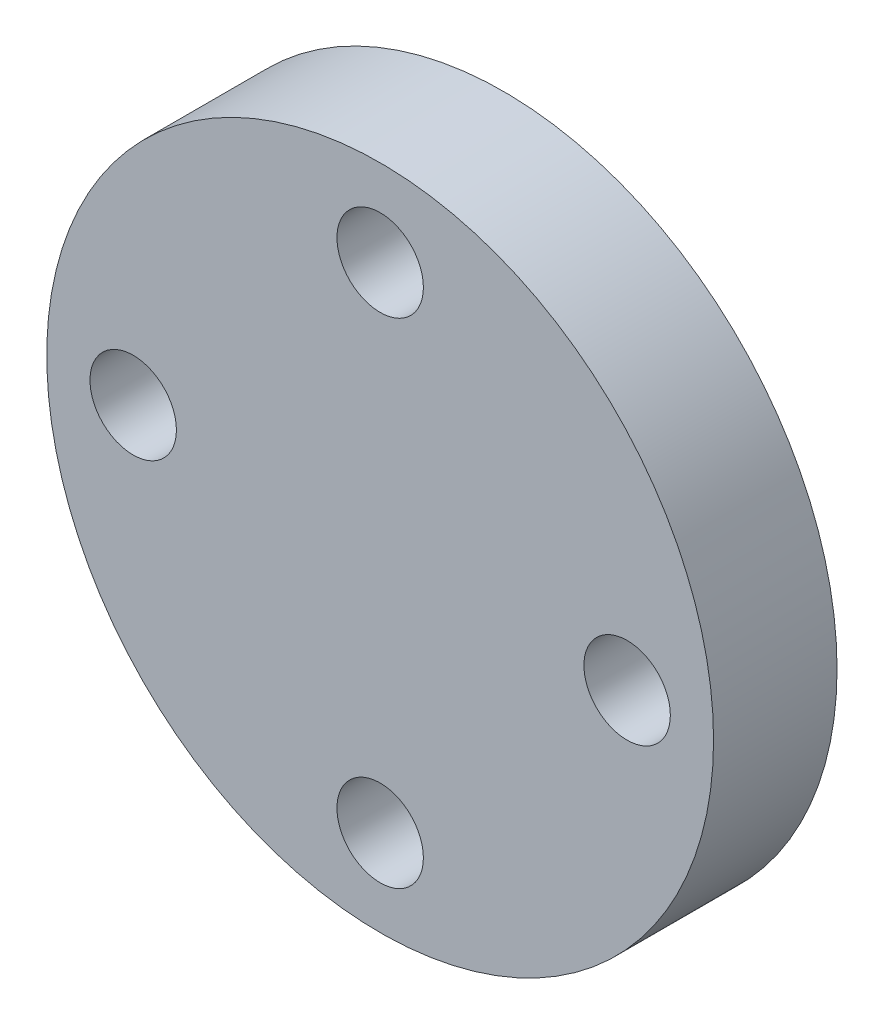
ISO-10303-21;
HEADER;
FILE_DESCRIPTION(('STEP AP214'),'2;1');
FILE_NAME('part.step','',(''),(''),'','','');
FILE_SCHEMA(('AUTOMOTIVE_DESIGN { 1 0 10303 214 1 1 1 1 }'));
ENDSEC;
DATA;
#1=APPLICATION_CONTEXT('core data for automotive mechanical design processes');
#2=APPLICATION_PROTOCOL_DEFINITION('international standard','automotive_design',2000,#1);
#3=PRODUCT_CONTEXT('',#1,'mechanical');
#4=PRODUCT('Part','Part','',(#3));
#5=PRODUCT_RELATED_PRODUCT_CATEGORY('part','',(#4));
#6=PRODUCT_DEFINITION_FORMATION('','',#4);
#7=PRODUCT_DEFINITION_CONTEXT('part definition',#1,'design');
#8=PRODUCT_DEFINITION('design','',#6,#7);
#9=PRODUCT_DEFINITION_SHAPE('','',#8);
#10=(LENGTH_UNIT() NAMED_UNIT(*) SI_UNIT(.MILLI.,.METRE.));
#11=(NAMED_UNIT(*) PLANE_ANGLE_UNIT() SI_UNIT($,.RADIAN.));
#12=(NAMED_UNIT(*) SI_UNIT($,.STERADIAN.) SOLID_ANGLE_UNIT());
#13=UNCERTAINTY_MEASURE_WITH_UNIT(LENGTH_MEASURE(1.E-05),#10,'distance_accuracy_value','');
#14=(GEOMETRIC_REPRESENTATION_CONTEXT(3) GLOBAL_UNCERTAINTY_ASSIGNED_CONTEXT((#13)) GLOBAL_UNIT_ASSIGNED_CONTEXT((#10,
#11,#12)) REPRESENTATION_CONTEXT('',''));
#15=CARTESIAN_POINT('',(0.,0.,0.));
#16=DIRECTION('',(0.,0.,1.));
#17=DIRECTION('',(1.,0.,0.));
#18=AXIS2_PLACEMENT_3D('',#15,#16,#17);
#19=CARTESIAN_POINT('',(0.,0.,5.));
#20=DIRECTION('',(0.,0.,1.));
#21=DIRECTION('',(1.,0.,0.));
#22=AXIS2_PLACEMENT_3D('',#19,#20,#21);
#23=PLANE('',#22);
#24=CARTESIAN_POINT('',(10.,0.,5.));
#25=DIRECTION('',(0.,0.,1.));
#26=DIRECTION('',(1.,0.,0.));
#27=AXIS2_PLACEMENT_3D('',#24,#25,#26);
#28=CIRCLE('',#27,1.75);
#29=CARTESIAN_POINT('',(11.75,0.,5.));
#30=VERTEX_POINT('',#29);
#31=EDGE_CURVE('E57',#30,#30,#28,.T.);
#32=ORIENTED_EDGE('',*,*,#31,.F.);
#33=EDGE_LOOP('',(#32));
#34=FACE_BOUND('',#33,.T.);
#35=CARTESIAN_POINT('',(-10.,0.,5.));
#36=DIRECTION('',(0.,0.,1.));
#37=DIRECTION('',(1.,0.,0.));
#38=AXIS2_PLACEMENT_3D('',#35,#36,#37);
#39=CIRCLE('',#38,1.75);
#40=CARTESIAN_POINT('',(-8.25,0.,5.));
#41=VERTEX_POINT('',#40);
#42=EDGE_CURVE('E46',#41,#41,#39,.T.);
#43=ORIENTED_EDGE('',*,*,#42,.F.);
#44=EDGE_LOOP('',(#43));
#45=FACE_BOUND('',#44,.T.);
#46=CARTESIAN_POINT('',(0.,0.,5.));
#47=DIRECTION('',(0.,0.,1.));
#48=DIRECTION('',(1.,0.,0.));
#49=AXIS2_PLACEMENT_3D('',#46,#47,#48);
#50=CIRCLE('',#49,13.5);
#51=CARTESIAN_POINT('',(13.5,0.,5.));
#52=VERTEX_POINT('',#51);
#53=EDGE_CURVE('E10',#52,#52,#50,.T.);
#54=ORIENTED_EDGE('',*,*,#53,.T.);
#55=EDGE_LOOP('',(#54));
#56=FACE_BOUND('',#55,.T.);
#57=CARTESIAN_POINT('',(0.,10.,5.));
#58=DIRECTION('',(0.,0.,1.));
#59=DIRECTION('',(1.,0.,0.));
#60=AXIS2_PLACEMENT_3D('',#57,#58,#59);
#61=CIRCLE('',#60,1.75);
#62=CARTESIAN_POINT('',(1.75000000000003,10.,5.));
#63=VERTEX_POINT('',#62);
#64=EDGE_CURVE('E51',#63,#63,#61,.T.);
#65=ORIENTED_EDGE('',*,*,#64,.F.);
#66=EDGE_LOOP('',(#65));
#67=FACE_BOUND('',#66,.T.);
#68=CARTESIAN_POINT('',(-1.04744440165294E-13,-10.,5.));
#69=DIRECTION('',(0.,0.,1.));
#70=DIRECTION('',(1.,0.,0.));
#71=AXIS2_PLACEMENT_3D('',#68,#69,#70);
#72=CIRCLE('',#71,1.75);
#73=CARTESIAN_POINT('',(1.7499999999999,-10.,5.));
#74=VERTEX_POINT('',#73);
#75=EDGE_CURVE('E63',#74,#74,#72,.T.);
#76=ORIENTED_EDGE('',*,*,#75,.F.);
#77=EDGE_LOOP('',(#76));
#78=FACE_BOUND('',#77,.T.);
#79=ADVANCED_FACE('F35',(#34,#45,#56,#67,#78),#23,.T.);
#80=CARTESIAN_POINT('',(0.,0.,0.));
#81=DIRECTION('',(0.,0.,1.));
#82=DIRECTION('',(1.,0.,0.));
#83=AXIS2_PLACEMENT_3D('',#80,#81,#82);
#84=PLANE('',#83);
#85=CARTESIAN_POINT('',(0.,0.,0.));
#86=DIRECTION('',(0.,0.,1.));
#87=DIRECTION('',(1.,0.,0.));
#88=AXIS2_PLACEMENT_3D('',#85,#86,#87);
#89=CIRCLE('',#88,13.5);
#90=CARTESIAN_POINT('',(13.5,0.,0.));
#91=VERTEX_POINT('',#90);
#92=EDGE_CURVE('E39',#91,#91,#89,.T.);
#93=ORIENTED_EDGE('',*,*,#92,.F.);
#94=EDGE_LOOP('',(#93));
#95=FACE_BOUND('',#94,.T.);
#96=CARTESIAN_POINT('',(-10.,0.,0.));
#97=DIRECTION('',(0.,0.,1.));
#98=DIRECTION('',(1.,0.,0.));
#99=AXIS2_PLACEMENT_3D('',#96,#97,#98);
#100=CIRCLE('',#99,1.75);
#101=CARTESIAN_POINT('',(-8.25,0.,0.));
#102=VERTEX_POINT('',#101);
#103=EDGE_CURVE('E48',#102,#102,#100,.T.);
#104=ORIENTED_EDGE('',*,*,#103,.T.);
#105=EDGE_LOOP('',(#104));
#106=FACE_BOUND('',#105,.T.);
#107=CARTESIAN_POINT('',(0.,10.,0.));
#108=DIRECTION('',(0.,0.,1.));
#109=DIRECTION('',(1.,0.,0.));
#110=AXIS2_PLACEMENT_3D('',#107,#108,#109);
#111=CIRCLE('',#110,1.75);
#112=CARTESIAN_POINT('',(1.75000000000003,10.,0.));
#113=VERTEX_POINT('',#112);
#114=EDGE_CURVE('E54',#113,#113,#111,.T.);
#115=ORIENTED_EDGE('',*,*,#114,.T.);
#116=EDGE_LOOP('',(#115));
#117=FACE_BOUND('',#116,.T.);
#118=CARTESIAN_POINT('',(10.,0.,0.));
#119=DIRECTION('',(0.,0.,1.));
#120=DIRECTION('',(1.,0.,0.));
#121=AXIS2_PLACEMENT_3D('',#118,#119,#120);
#122=CIRCLE('',#121,1.75);
#123=CARTESIAN_POINT('',(11.75,0.,0.));
#124=VERTEX_POINT('',#123);
#125=EDGE_CURVE('E60',#124,#124,#122,.T.);
#126=ORIENTED_EDGE('',*,*,#125,.T.);
#127=EDGE_LOOP('',(#126));
#128=FACE_BOUND('',#127,.T.);
#129=CARTESIAN_POINT('',(-1.04744440165294E-13,-10.,0.));
#130=DIRECTION('',(0.,0.,1.));
#131=DIRECTION('',(1.,0.,0.));
#132=AXIS2_PLACEMENT_3D('',#129,#130,#131);
#133=CIRCLE('',#132,1.75);
#134=CARTESIAN_POINT('',(1.7499999999999,-10.,0.));
#135=VERTEX_POINT('',#134);
#136=EDGE_CURVE('E66',#135,#135,#133,.T.);
#137=ORIENTED_EDGE('',*,*,#136,.T.);
#138=EDGE_LOOP('',(#137));
#139=FACE_BOUND('',#138,.T.);
#140=ADVANCED_FACE('F76',(#95,#106,#117,#128,#139),#84,.F.);
#141=CARTESIAN_POINT('',(0.,0.,5.));
#142=DIRECTION('',(0.,0.,-1.));
#143=DIRECTION('',(-1.,0.,0.));
#144=AXIS2_PLACEMENT_3D('',#141,#142,#143);
#145=CYLINDRICAL_SURFACE('',#144,13.5);
#146=ORIENTED_EDGE('',*,*,#53,.F.);
#147=EDGE_LOOP('',(#146));
#148=FACE_BOUND('',#147,.T.);
#149=ORIENTED_EDGE('',*,*,#92,.T.);
#150=EDGE_LOOP('',(#149));
#151=FACE_BOUND('',#150,.T.);
#152=ADVANCED_FACE('F37',(#148,#151),#145,.T.);
#153=CARTESIAN_POINT('',(-10.,0.,5.));
#154=DIRECTION('',(0.,0.,-1.));
#155=DIRECTION('',(-1.,0.,0.));
#156=AXIS2_PLACEMENT_3D('',#153,#154,#155);
#157=CYLINDRICAL_SURFACE('',#156,1.75);
#158=ORIENTED_EDGE('',*,*,#42,.T.);
#159=EDGE_LOOP('',(#158));
#160=FACE_BOUND('',#159,.T.);
#161=ORIENTED_EDGE('',*,*,#103,.F.);
#162=EDGE_LOOP('',(#161));
#163=FACE_BOUND('',#162,.T.);
#164=ADVANCED_FACE('F86',(#160,#163),#157,.F.);
#165=CARTESIAN_POINT('',(0.,10.,5.));
#166=DIRECTION('',(0.,0.,-1.));
#167=DIRECTION('',(-1.,0.,0.));
#168=AXIS2_PLACEMENT_3D('',#165,#166,#167);
#169=CYLINDRICAL_SURFACE('',#168,1.75);
#170=ORIENTED_EDGE('',*,*,#64,.T.);
#171=EDGE_LOOP('',(#170));
#172=FACE_BOUND('',#171,.T.);
#173=ORIENTED_EDGE('',*,*,#114,.F.);
#174=EDGE_LOOP('',(#173));
#175=FACE_BOUND('',#174,.T.);
#176=ADVANCED_FACE('F89',(#172,#175),#169,.F.);
#177=CARTESIAN_POINT('',(10.,0.,5.));
#178=DIRECTION('',(0.,0.,-1.));
#179=DIRECTION('',(-1.,0.,0.));
#180=AXIS2_PLACEMENT_3D('',#177,#178,#179);
#181=CYLINDRICAL_SURFACE('',#180,1.75);
#182=ORIENTED_EDGE('',*,*,#31,.T.);
#183=EDGE_LOOP('',(#182));
#184=FACE_BOUND('',#183,.T.);
#185=ORIENTED_EDGE('',*,*,#125,.F.);
#186=EDGE_LOOP('',(#185));
#187=FACE_BOUND('',#186,.T.);
#188=ADVANCED_FACE('F93',(#184,#187),#181,.F.);
#189=CARTESIAN_POINT('',(-1.04744440165294E-13,-10.,5.));
#190=DIRECTION('',(0.,0.,-1.));
#191=DIRECTION('',(-1.,0.,0.));
#192=AXIS2_PLACEMENT_3D('',#189,#190,#191);
#193=CYLINDRICAL_SURFACE('',#192,1.75);
#194=ORIENTED_EDGE('',*,*,#75,.T.);
#195=EDGE_LOOP('',(#194));
#196=FACE_BOUND('',#195,.T.);
#197=ORIENTED_EDGE('',*,*,#136,.F.);
#198=EDGE_LOOP('',(#197));
#199=FACE_BOUND('',#198,.T.);
#200=ADVANCED_FACE('F72',(#196,#199),#193,.F.);
#201=CLOSED_SHELL('',(#79,#140,#152,#164,#176,#188,#200));
#202=MANIFOLD_SOLID_BREP('B2',#201);
#203=ADVANCED_BREP_SHAPE_REPRESENTATION('',(#18,#202),#14);
#204=SHAPE_DEFINITION_REPRESENTATION(#9,#203);
ENDSEC;
END-ISO-10303-21;
